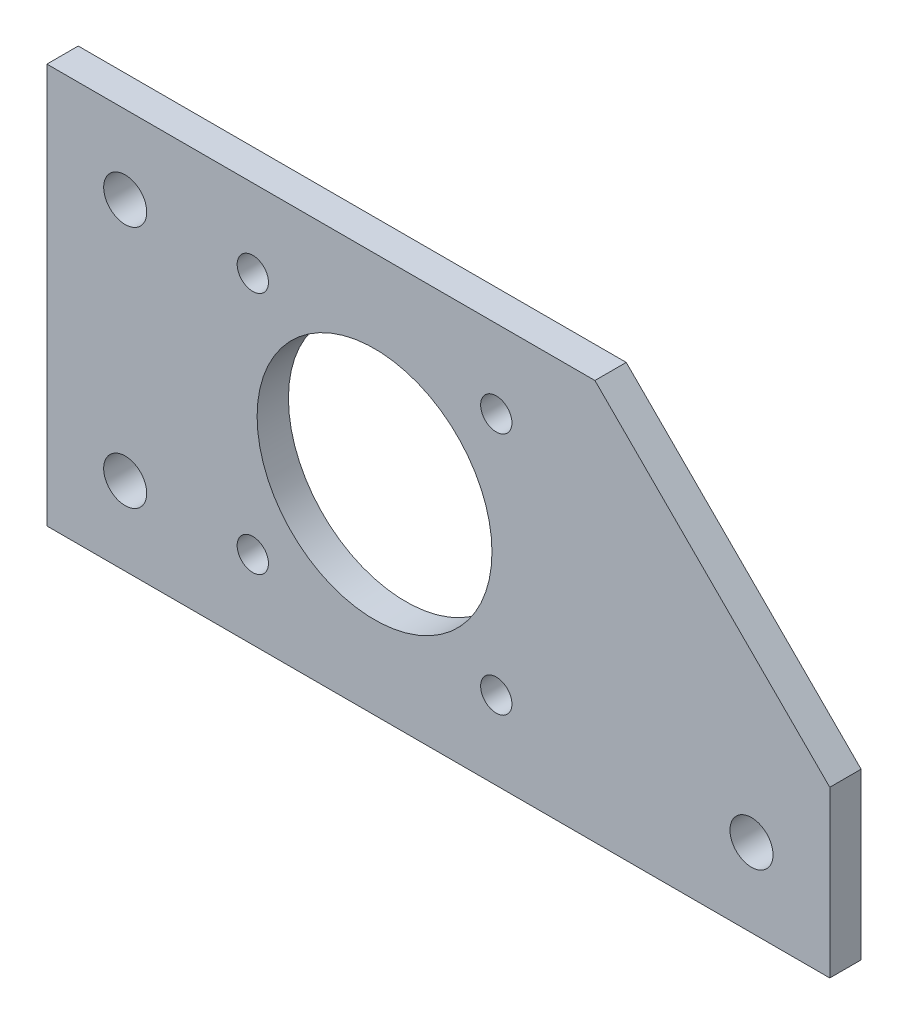
ISO-10303-21;
HEADER;
FILE_DESCRIPTION(('STEP AP214'),'2;1');
FILE_NAME('part.step','',(''),(''),'','','');
FILE_SCHEMA(('AUTOMOTIVE_DESIGN { 1 0 10303 214 1 1 1 1 }'));
ENDSEC;
DATA;
#1=APPLICATION_CONTEXT('core data for automotive mechanical design processes');
#2=APPLICATION_PROTOCOL_DEFINITION('international standard','automotive_design',2000,#1);
#3=PRODUCT_CONTEXT('',#1,'mechanical');
#4=PRODUCT('Part','Part','',(#3));
#5=PRODUCT_RELATED_PRODUCT_CATEGORY('part','',(#4));
#6=PRODUCT_DEFINITION_FORMATION('','',#4);
#7=PRODUCT_DEFINITION_CONTEXT('part definition',#1,'design');
#8=PRODUCT_DEFINITION('design','',#6,#7);
#9=PRODUCT_DEFINITION_SHAPE('','',#8);
#10=(LENGTH_UNIT() NAMED_UNIT(*) SI_UNIT(.MILLI.,.METRE.));
#11=(NAMED_UNIT(*) PLANE_ANGLE_UNIT() SI_UNIT($,.RADIAN.));
#12=(NAMED_UNIT(*) SI_UNIT($,.STERADIAN.) SOLID_ANGLE_UNIT());
#13=UNCERTAINTY_MEASURE_WITH_UNIT(LENGTH_MEASURE(1.E-05),#10,'distance_accuracy_value','');
#14=(GEOMETRIC_REPRESENTATION_CONTEXT(3) GLOBAL_UNCERTAINTY_ASSIGNED_CONTEXT((#13)) GLOBAL_UNIT_ASSIGNED_CONTEXT((#10,
#11,#12)) REPRESENTATION_CONTEXT('',''));
#15=CARTESIAN_POINT('',(0.,0.,0.));
#16=DIRECTION('',(0.,0.,1.));
#17=DIRECTION('',(1.,0.,0.));
#18=AXIS2_PLACEMENT_3D('',#15,#16,#17);
#19=CARTESIAN_POINT('',(-31.5,-21.15,4.));
#20=DIRECTION('',(1.,0.,0.));
#21=DIRECTION('',(0.,0.,-1.));
#22=AXIS2_PLACEMENT_3D('',#19,#20,#21);
#23=PLANE('',#22);
#24=DIRECTION('',(0.,-1.,0.));
#25=VECTOR('',#24,1.);
#26=CARTESIAN_POINT('',(-31.5,-21.15,0.));
#27=LINE('',#26,#25);
#28=CARTESIAN_POINT('',(-31.5,25.55,0.));
#29=VERTEX_POINT('',#28);
#30=CARTESIAN_POINT('',(-31.5,-25.55,0.));
#31=VERTEX_POINT('',#30);
#32=EDGE_CURVE('E96',#29,#31,#27,.T.);
#33=ORIENTED_EDGE('',*,*,#32,.T.);
#34=DIRECTION('',(0.,0.,-1.));
#35=VECTOR('',#34,1.);
#36=CARTESIAN_POINT('',(-31.5,-25.55,4.));
#37=LINE('',#36,#35);
#38=CARTESIAN_POINT('',(-31.5,-25.55,4.));
#39=VERTEX_POINT('',#38);
#40=EDGE_CURVE('E92',#39,#31,#37,.T.);
#41=ORIENTED_EDGE('',*,*,#40,.F.);
#42=DIRECTION('',(0.,-1.,0.));
#43=VECTOR('',#42,1.);
#44=CARTESIAN_POINT('',(-31.5,21.15,4.));
#45=LINE('',#44,#43);
#46=CARTESIAN_POINT('',(-31.5,25.55,4.));
#47=VERTEX_POINT('',#46);
#48=EDGE_CURVE('E159',#47,#39,#45,.T.);
#49=ORIENTED_EDGE('',*,*,#48,.F.);
#50=DIRECTION('',(0.,0.,-1.));
#51=VECTOR('',#50,1.);
#52=CARTESIAN_POINT('',(-31.5,25.55,4.));
#53=LINE('',#52,#51);
#54=EDGE_CURVE('E165',#47,#29,#53,.T.);
#55=ORIENTED_EDGE('',*,*,#54,.T.);
#56=EDGE_LOOP('',(#33,#41,#49,#55));
#57=FACE_BOUND('',#56,.T.);
#58=ADVANCED_FACE('F39',(#57),#23,.F.);
#59=CARTESIAN_POINT('',(-31.5,-25.55,4.));
#60=DIRECTION('',(0.,1.,0.));
#61=DIRECTION('',(0.,0.,1.));
#62=AXIS2_PLACEMENT_3D('',#59,#60,#61);
#63=PLANE('',#62);
#64=DIRECTION('',(1.,0.,0.));
#65=VECTOR('',#64,1.);
#66=CARTESIAN_POINT('',(-31.5,-25.55,0.));
#67=LINE('',#66,#65);
#68=CARTESIAN_POINT('',(68.5,-25.55,0.));
#69=VERTEX_POINT('',#68);
#70=EDGE_CURVE('E85',#31,#69,#67,.T.);
#71=ORIENTED_EDGE('',*,*,#70,.T.);
#72=DIRECTION('',(0.,0.,-1.));
#73=VECTOR('',#72,1.);
#74=CARTESIAN_POINT('',(68.5,-25.55,4.));
#75=LINE('',#74,#73);
#76=CARTESIAN_POINT('',(68.5,-25.55,4.));
#77=VERTEX_POINT('',#76);
#78=EDGE_CURVE('E90',#77,#69,#75,.T.);
#79=ORIENTED_EDGE('',*,*,#78,.F.);
#80=DIRECTION('',(1.,0.,0.));
#81=VECTOR('',#80,1.);
#82=CARTESIAN_POINT('',(-31.5,-25.55,4.));
#83=LINE('',#82,#81);
#84=EDGE_CURVE('E161',#39,#77,#83,.T.);
#85=ORIENTED_EDGE('',*,*,#84,.F.);
#86=ORIENTED_EDGE('',*,*,#40,.T.);
#87=EDGE_LOOP('',(#71,#79,#85,#86));
#88=FACE_BOUND('',#87,.T.);
#89=ADVANCED_FACE('F87',(#88),#63,.F.);
#90=CARTESIAN_POINT('',(-31.5,25.55,4.));
#91=DIRECTION('',(0.,-1.,0.));
#92=DIRECTION('',(0.,0.,-1.));
#93=AXIS2_PLACEMENT_3D('',#90,#91,#92);
#94=PLANE('',#93);
#95=DIRECTION('',(-1.,0.,0.));
#96=VECTOR('',#95,1.);
#97=CARTESIAN_POINT('',(-31.5,25.55,4.));
#98=LINE('',#97,#96);
#99=CARTESIAN_POINT('',(38.4999999999999,25.55,4.));
#100=VERTEX_POINT('',#99);
#101=EDGE_CURVE('E163',#100,#47,#98,.T.);
#102=ORIENTED_EDGE('',*,*,#101,.F.);
#103=DIRECTION('',(0.,0.,-1.));
#104=VECTOR('',#103,1.);
#105=CARTESIAN_POINT('',(38.4999999999999,25.55,0.));
#106=LINE('',#105,#104);
#107=CARTESIAN_POINT('',(38.4999999999999,25.55,0.));
#108=VERTEX_POINT('',#107);
#109=EDGE_CURVE('E47',#100,#108,#106,.T.);
#110=ORIENTED_EDGE('',*,*,#109,.T.);
#111=DIRECTION('',(-1.,0.,0.));
#112=VECTOR('',#111,1.);
#113=CARTESIAN_POINT('',(-31.5,25.55,0.));
#114=LINE('',#113,#112);
#115=EDGE_CURVE('E95',#108,#29,#114,.T.);
#116=ORIENTED_EDGE('',*,*,#115,.T.);
#117=ORIENTED_EDGE('',*,*,#54,.F.);
#118=EDGE_LOOP('',(#102,#110,#116,#117));
#119=FACE_BOUND('',#118,.T.);
#120=ADVANCED_FACE('F189',(#119),#94,.F.);
#121=CARTESIAN_POINT('',(0.,0.,4.));
#122=DIRECTION('',(0.,0.,-1.));
#123=DIRECTION('',(-1.,0.,0.));
#124=AXIS2_PLACEMENT_3D('',#121,#122,#123);
#125=PLANE('',#124);
#126=CARTESIAN_POINT('',(58.5,-15.55,4.));
#127=DIRECTION('',(0.,0.,1.));
#128=DIRECTION('',(1.,0.,0.));
#129=AXIS2_PLACEMENT_3D('',#126,#127,#128);
#130=CIRCLE('',#129,2.75000000000001);
#131=CARTESIAN_POINT('',(61.25,-15.55,4.));
#132=VERTEX_POINT('',#131);
#133=EDGE_CURVE('E109',#132,#132,#130,.T.);
#134=ORIENTED_EDGE('',*,*,#133,.F.);
#135=EDGE_LOOP('',(#134));
#136=FACE_BOUND('',#135,.T.);
#137=CARTESIAN_POINT('',(-21.5,15.55,4.));
#138=DIRECTION('',(0.,0.,1.));
#139=DIRECTION('',(1.,0.,0.));
#140=AXIS2_PLACEMENT_3D('',#137,#138,#139);
#141=CIRCLE('',#140,2.75);
#142=CARTESIAN_POINT('',(-18.75,15.55,4.));
#143=VERTEX_POINT('',#142);
#144=EDGE_CURVE('E130',#143,#143,#141,.T.);
#145=ORIENTED_EDGE('',*,*,#144,.F.);
#146=EDGE_LOOP('',(#145));
#147=FACE_BOUND('',#146,.T.);
#148=CARTESIAN_POINT('',(-21.5,-15.55,4.));
#149=DIRECTION('',(0.,0.,1.));
#150=DIRECTION('',(1.,0.,0.));
#151=AXIS2_PLACEMENT_3D('',#148,#149,#150);
#152=CIRCLE('',#151,2.75);
#153=CARTESIAN_POINT('',(-18.75,-15.55,4.));
#154=VERTEX_POINT('',#153);
#155=EDGE_CURVE('E118',#154,#154,#152,.T.);
#156=ORIENTED_EDGE('',*,*,#155,.F.);
#157=EDGE_LOOP('',(#156));
#158=FACE_BOUND('',#157,.T.);
#159=CARTESIAN_POINT('',(10.35,0.,4.));
#160=DIRECTION('',(0.,0.,1.));
#161=DIRECTION('',(1.,0.,0.));
#162=AXIS2_PLACEMENT_3D('',#159,#160,#161);
#163=CIRCLE('',#162,15.);
#164=CARTESIAN_POINT('',(25.35,0.,4.));
#165=VERTEX_POINT('',#164);
#166=EDGE_CURVE('E125',#165,#165,#163,.T.);
#167=ORIENTED_EDGE('',*,*,#166,.F.);
#168=EDGE_LOOP('',(#167));
#169=FACE_BOUND('',#168,.T.);
#170=CARTESIAN_POINT('',(-5.2,-15.55,4.));
#171=DIRECTION('',(0.,0.,1.));
#172=DIRECTION('',(1.,0.,0.));
#173=AXIS2_PLACEMENT_3D('',#170,#171,#172);
#174=CIRCLE('',#173,2.);
#175=CARTESIAN_POINT('',(-3.2,-15.55,4.));
#176=VERTEX_POINT('',#175);
#177=EDGE_CURVE('E149',#176,#176,#174,.T.);
#178=ORIENTED_EDGE('',*,*,#177,.F.);
#179=EDGE_LOOP('',(#178));
#180=FACE_BOUND('',#179,.T.);
#181=CARTESIAN_POINT('',(25.9,-15.55,4.));
#182=DIRECTION('',(0.,0.,1.));
#183=DIRECTION('',(1.,0.,0.));
#184=AXIS2_PLACEMENT_3D('',#181,#182,#183);
#185=CIRCLE('',#184,2.);
#186=CARTESIAN_POINT('',(27.9,-15.55,4.));
#187=VERTEX_POINT('',#186);
#188=EDGE_CURVE('E143',#187,#187,#185,.T.);
#189=ORIENTED_EDGE('',*,*,#188,.F.);
#190=EDGE_LOOP('',(#189));
#191=FACE_BOUND('',#190,.T.);
#192=CARTESIAN_POINT('',(25.9,15.55,4.));
#193=DIRECTION('',(0.,0.,1.));
#194=DIRECTION('',(1.,0.,0.));
#195=AXIS2_PLACEMENT_3D('',#192,#193,#194);
#196=CIRCLE('',#195,2.00000000000001);
#197=CARTESIAN_POINT('',(27.9,15.55,4.));
#198=VERTEX_POINT('',#197);
#199=EDGE_CURVE('E136',#198,#198,#196,.T.);
#200=ORIENTED_EDGE('',*,*,#199,.F.);
#201=EDGE_LOOP('',(#200));
#202=FACE_BOUND('',#201,.T.);
#203=CARTESIAN_POINT('',(-5.2,15.55,4.));
#204=DIRECTION('',(0.,0.,1.));
#205=DIRECTION('',(1.,0.,0.));
#206=AXIS2_PLACEMENT_3D('',#203,#204,#205);
#207=CIRCLE('',#206,2.);
#208=CARTESIAN_POINT('',(-3.2,15.55,4.));
#209=VERTEX_POINT('',#208);
#210=EDGE_CURVE('E154',#209,#209,#207,.T.);
#211=ORIENTED_EDGE('',*,*,#210,.F.);
#212=EDGE_LOOP('',(#211));
#213=FACE_BOUND('',#212,.T.);
#214=DIRECTION('',(0.,-1.,0.));
#215=VECTOR('',#214,1.);
#216=CARTESIAN_POINT('',(68.5,-25.55,4.));
#217=LINE('',#216,#215);
#218=CARTESIAN_POINT('',(68.5,-4.45000000000001,4.));
#219=VERTEX_POINT('',#218);
#220=EDGE_CURVE('E105',#219,#77,#217,.T.);
#221=ORIENTED_EDGE('',*,*,#220,.F.);
#222=DIRECTION('',(-0.707106781186549,0.707106781186546,0.));
#223=VECTOR('',#222,1.);
#224=CARTESIAN_POINT('',(68.5,-4.45000000000001,4.));
#225=LINE('',#224,#223);
#226=EDGE_CURVE('E61',#219,#100,#225,.T.);
#227=ORIENTED_EDGE('',*,*,#226,.T.);
#228=ORIENTED_EDGE('',*,*,#101,.T.);
#229=ORIENTED_EDGE('',*,*,#48,.T.);
#230=ORIENTED_EDGE('',*,*,#84,.T.);
#231=EDGE_LOOP('',(#221,#227,#228,#229,#230));
#232=FACE_BOUND('',#231,.T.);
#233=ADVANCED_FACE('F174',(#136,#147,#158,#169,#180,#191,#202,#213,#232),#125,.F.);
#234=CARTESIAN_POINT('',(0.,0.,0.));
#235=DIRECTION('',(0.,0.,-1.));
#236=DIRECTION('',(-1.,0.,0.));
#237=AXIS2_PLACEMENT_3D('',#234,#235,#236);
#238=PLANE('',#237);
#239=CARTESIAN_POINT('',(58.5,-15.55,0.));
#240=DIRECTION('',(0.,0.,-1.));
#241=DIRECTION('',(-1.,0.,0.));
#242=AXIS2_PLACEMENT_3D('',#239,#240,#241);
#243=CIRCLE('',#242,2.75000000000001);
#244=CARTESIAN_POINT('',(55.75,-15.55,0.));
#245=VERTEX_POINT('',#244);
#246=EDGE_CURVE('E112',#245,#245,#243,.F.);
#247=ORIENTED_EDGE('',*,*,#246,.T.);
#248=EDGE_LOOP('',(#247));
#249=FACE_BOUND('',#248,.T.);
#250=CARTESIAN_POINT('',(-21.5,15.55,0.));
#251=DIRECTION('',(0.,0.,-1.));
#252=DIRECTION('',(-1.,0.,0.));
#253=AXIS2_PLACEMENT_3D('',#250,#251,#252);
#254=CIRCLE('',#253,2.75);
#255=CARTESIAN_POINT('',(-24.25,15.55,0.));
#256=VERTEX_POINT('',#255);
#257=EDGE_CURVE('E121',#256,#256,#254,.F.);
#258=ORIENTED_EDGE('',*,*,#257,.T.);
#259=EDGE_LOOP('',(#258));
#260=FACE_BOUND('',#259,.T.);
#261=CARTESIAN_POINT('',(-21.5,-15.55,0.));
#262=DIRECTION('',(0.,0.,-1.));
#263=DIRECTION('',(-1.,0.,0.));
#264=AXIS2_PLACEMENT_3D('',#261,#262,#263);
#265=CIRCLE('',#264,2.75);
#266=CARTESIAN_POINT('',(-24.25,-15.55,0.));
#267=VERTEX_POINT('',#266);
#268=EDGE_CURVE('E122',#267,#267,#265,.F.);
#269=ORIENTED_EDGE('',*,*,#268,.T.);
#270=EDGE_LOOP('',(#269));
#271=FACE_BOUND('',#270,.T.);
#272=CARTESIAN_POINT('',(10.35,0.,0.));
#273=DIRECTION('',(0.,0.,-1.));
#274=DIRECTION('',(-1.,0.,0.));
#275=AXIS2_PLACEMENT_3D('',#272,#273,#274);
#276=CIRCLE('',#275,15.);
#277=CARTESIAN_POINT('',(-4.65,0.,0.));
#278=VERTEX_POINT('',#277);
#279=EDGE_CURVE('E117',#278,#278,#276,.F.);
#280=ORIENTED_EDGE('',*,*,#279,.T.);
#281=EDGE_LOOP('',(#280));
#282=FACE_BOUND('',#281,.T.);
#283=CARTESIAN_POINT('',(-5.2,-15.55,0.));
#284=DIRECTION('',(0.,0.,-1.));
#285=DIRECTION('',(-1.,0.,0.));
#286=AXIS2_PLACEMENT_3D('',#283,#284,#285);
#287=CIRCLE('',#286,2.);
#288=CARTESIAN_POINT('',(-7.2,-15.55,0.));
#289=VERTEX_POINT('',#288);
#290=EDGE_CURVE('E133',#289,#289,#287,.F.);
#291=ORIENTED_EDGE('',*,*,#290,.T.);
#292=EDGE_LOOP('',(#291));
#293=FACE_BOUND('',#292,.T.);
#294=CARTESIAN_POINT('',(25.9,-15.55,0.));
#295=DIRECTION('',(0.,0.,-1.));
#296=DIRECTION('',(-1.,0.,0.));
#297=AXIS2_PLACEMENT_3D('',#294,#295,#296);
#298=CIRCLE('',#297,2.);
#299=CARTESIAN_POINT('',(23.9,-15.55,0.));
#300=VERTEX_POINT('',#299);
#301=EDGE_CURVE('E146',#300,#300,#298,.F.);
#302=ORIENTED_EDGE('',*,*,#301,.T.);
#303=EDGE_LOOP('',(#302));
#304=FACE_BOUND('',#303,.T.);
#305=CARTESIAN_POINT('',(25.9,15.55,0.));
#306=DIRECTION('',(0.,0.,-1.));
#307=DIRECTION('',(-1.,0.,0.));
#308=AXIS2_PLACEMENT_3D('',#305,#306,#307);
#309=CIRCLE('',#308,2.00000000000001);
#310=CARTESIAN_POINT('',(23.9,15.55,0.));
#311=VERTEX_POINT('',#310);
#312=EDGE_CURVE('E140',#311,#311,#309,.F.);
#313=ORIENTED_EDGE('',*,*,#312,.T.);
#314=EDGE_LOOP('',(#313));
#315=FACE_BOUND('',#314,.T.);
#316=CARTESIAN_POINT('',(-5.2,15.55,0.));
#317=DIRECTION('',(0.,0.,-1.));
#318=DIRECTION('',(-1.,0.,0.));
#319=AXIS2_PLACEMENT_3D('',#316,#317,#318);
#320=CIRCLE('',#319,2.);
#321=CARTESIAN_POINT('',(-7.2,15.55,0.));
#322=VERTEX_POINT('',#321);
#323=EDGE_CURVE('E139',#322,#322,#320,.F.);
#324=ORIENTED_EDGE('',*,*,#323,.T.);
#325=EDGE_LOOP('',(#324));
#326=FACE_BOUND('',#325,.T.);
#327=ORIENTED_EDGE('',*,*,#115,.F.);
#328=DIRECTION('',(0.707106781186549,-0.707106781186546,0.));
#329=VECTOR('',#328,1.);
#330=CARTESIAN_POINT('',(32.0249999999999,32.025,0.));
#331=LINE('',#330,#329);
#332=CARTESIAN_POINT('',(68.5,-4.45000000000001,0.));
#333=VERTEX_POINT('',#332);
#334=EDGE_CURVE('E11',#108,#333,#331,.T.);
#335=ORIENTED_EDGE('',*,*,#334,.T.);
#336=DIRECTION('',(0.,1.,0.));
#337=VECTOR('',#336,1.);
#338=CARTESIAN_POINT('',(68.5,-25.55,0.));
#339=LINE('',#338,#337);
#340=EDGE_CURVE('E99',#69,#333,#339,.T.);
#341=ORIENTED_EDGE('',*,*,#340,.F.);
#342=ORIENTED_EDGE('',*,*,#70,.F.);
#343=ORIENTED_EDGE('',*,*,#32,.F.);
#344=EDGE_LOOP('',(#327,#335,#341,#342,#343));
#345=FACE_BOUND('',#344,.T.);
#346=ADVANCED_FACE('F100',(#249,#260,#271,#282,#293,#304,#315,#326,#345),#238,.T.);
#347=CARTESIAN_POINT('',(-5.2,15.55,-0.00100000000000013));
#348=DIRECTION('',(0.,0.,1.));
#349=DIRECTION('',(1.,0.,0.));
#350=AXIS2_PLACEMENT_3D('',#347,#348,#349);
#351=CYLINDRICAL_SURFACE('',#350,2.);
#352=ORIENTED_EDGE('',*,*,#323,.F.);
#353=EDGE_LOOP('',(#352));
#354=FACE_BOUND('',#353,.T.);
#355=ORIENTED_EDGE('',*,*,#210,.T.);
#356=EDGE_LOOP('',(#355));
#357=FACE_BOUND('',#356,.T.);
#358=ADVANCED_FACE('F196',(#354,#357),#351,.F.);
#359=CARTESIAN_POINT('',(25.9,15.55,-0.00100000000000013));
#360=DIRECTION('',(0.,0.,1.));
#361=DIRECTION('',(1.,0.,0.));
#362=AXIS2_PLACEMENT_3D('',#359,#360,#361);
#363=CYLINDRICAL_SURFACE('',#362,2.00000000000001);
#364=ORIENTED_EDGE('',*,*,#312,.F.);
#365=EDGE_LOOP('',(#364));
#366=FACE_BOUND('',#365,.T.);
#367=ORIENTED_EDGE('',*,*,#199,.T.);
#368=EDGE_LOOP('',(#367));
#369=FACE_BOUND('',#368,.T.);
#370=ADVANCED_FACE('F203',(#366,#369),#363,.F.);
#371=CARTESIAN_POINT('',(25.9,-15.55,-0.00100000000000013));
#372=DIRECTION('',(0.,0.,1.));
#373=DIRECTION('',(1.,0.,0.));
#374=AXIS2_PLACEMENT_3D('',#371,#372,#373);
#375=CYLINDRICAL_SURFACE('',#374,2.);
#376=ORIENTED_EDGE('',*,*,#301,.F.);
#377=EDGE_LOOP('',(#376));
#378=FACE_BOUND('',#377,.T.);
#379=ORIENTED_EDGE('',*,*,#188,.T.);
#380=EDGE_LOOP('',(#379));
#381=FACE_BOUND('',#380,.T.);
#382=ADVANCED_FACE('F209',(#378,#381),#375,.F.);
#383=CARTESIAN_POINT('',(-5.2,-15.55,-0.00100000000000013));
#384=DIRECTION('',(0.,0.,1.));
#385=DIRECTION('',(1.,0.,0.));
#386=AXIS2_PLACEMENT_3D('',#383,#384,#385);
#387=CYLINDRICAL_SURFACE('',#386,2.);
#388=ORIENTED_EDGE('',*,*,#290,.F.);
#389=EDGE_LOOP('',(#388));
#390=FACE_BOUND('',#389,.T.);
#391=ORIENTED_EDGE('',*,*,#177,.T.);
#392=EDGE_LOOP('',(#391));
#393=FACE_BOUND('',#392,.T.);
#394=ADVANCED_FACE('F205',(#390,#393),#387,.F.);
#395=CARTESIAN_POINT('',(10.35,0.,-0.00100000000000013));
#396=DIRECTION('',(0.,0.,1.));
#397=DIRECTION('',(1.,0.,0.));
#398=AXIS2_PLACEMENT_3D('',#395,#396,#397);
#399=CYLINDRICAL_SURFACE('',#398,15.);
#400=ORIENTED_EDGE('',*,*,#279,.F.);
#401=EDGE_LOOP('',(#400));
#402=FACE_BOUND('',#401,.T.);
#403=ORIENTED_EDGE('',*,*,#166,.T.);
#404=EDGE_LOOP('',(#403));
#405=FACE_BOUND('',#404,.T.);
#406=ADVANCED_FACE('F208',(#402,#405),#399,.F.);
#407=CARTESIAN_POINT('',(-21.5,-15.55,-0.00100000000000013));
#408=DIRECTION('',(0.,0.,1.));
#409=DIRECTION('',(1.,0.,0.));
#410=AXIS2_PLACEMENT_3D('',#407,#408,#409);
#411=CYLINDRICAL_SURFACE('',#410,2.75);
#412=ORIENTED_EDGE('',*,*,#268,.F.);
#413=EDGE_LOOP('',(#412));
#414=FACE_BOUND('',#413,.T.);
#415=ORIENTED_EDGE('',*,*,#155,.T.);
#416=EDGE_LOOP('',(#415));
#417=FACE_BOUND('',#416,.T.);
#418=ADVANCED_FACE('F220',(#414,#417),#411,.F.);
#419=CARTESIAN_POINT('',(-21.5,15.55,-0.00100000000000013));
#420=DIRECTION('',(0.,0.,1.));
#421=DIRECTION('',(1.,0.,0.));
#422=AXIS2_PLACEMENT_3D('',#419,#420,#421);
#423=CYLINDRICAL_SURFACE('',#422,2.75);
#424=ORIENTED_EDGE('',*,*,#257,.F.);
#425=EDGE_LOOP('',(#424));
#426=FACE_BOUND('',#425,.T.);
#427=ORIENTED_EDGE('',*,*,#144,.T.);
#428=EDGE_LOOP('',(#427));
#429=FACE_BOUND('',#428,.T.);
#430=ADVANCED_FACE('F217',(#426,#429),#423,.F.);
#431=CARTESIAN_POINT('',(68.5,0.,0.));
#432=DIRECTION('',(1.,0.,0.));
#433=DIRECTION('',(0.,0.,-1.));
#434=AXIS2_PLACEMENT_3D('',#431,#432,#433);
#435=PLANE('',#434);
#436=ORIENTED_EDGE('',*,*,#340,.T.);
#437=DIRECTION('',(0.,0.,1.));
#438=VECTOR('',#437,1.);
#439=CARTESIAN_POINT('',(68.5,-4.45000000000001,4.));
#440=LINE('',#439,#438);
#441=EDGE_CURVE('E171',#333,#219,#440,.T.);
#442=ORIENTED_EDGE('',*,*,#441,.T.);
#443=ORIENTED_EDGE('',*,*,#220,.T.);
#444=ORIENTED_EDGE('',*,*,#78,.T.);
#445=EDGE_LOOP('',(#436,#442,#443,#444));
#446=FACE_BOUND('',#445,.T.);
#447=ADVANCED_FACE('F107',(#446),#435,.T.);
#448=CARTESIAN_POINT('',(58.5,-15.55,-0.00100000000000013));
#449=DIRECTION('',(0.,0.,1.));
#450=DIRECTION('',(1.,0.,0.));
#451=AXIS2_PLACEMENT_3D('',#448,#449,#450);
#452=CYLINDRICAL_SURFACE('',#451,2.75000000000001);
#453=ORIENTED_EDGE('',*,*,#246,.F.);
#454=EDGE_LOOP('',(#453));
#455=FACE_BOUND('',#454,.T.);
#456=ORIENTED_EDGE('',*,*,#133,.T.);
#457=EDGE_LOOP('',(#456));
#458=FACE_BOUND('',#457,.T.);
#459=ADVANCED_FACE('F179',(#455,#458),#452,.F.);
#460=CARTESIAN_POINT('',(68.5,-4.45000000000001,0.));
#461=DIRECTION('',(0.707106781186546,0.707106781186549,0.));
#462=DIRECTION('',(0.,0.,-1.));
#463=AXIS2_PLACEMENT_3D('',#460,#461,#462);
#464=PLANE('',#463);
#465=ORIENTED_EDGE('',*,*,#334,.F.);
#466=ORIENTED_EDGE('',*,*,#109,.F.);
#467=ORIENTED_EDGE('',*,*,#226,.F.);
#468=ORIENTED_EDGE('',*,*,#441,.F.);
#469=EDGE_LOOP('',(#465,#466,#467,#468));
#470=FACE_BOUND('',#469,.T.);
#471=ADVANCED_FACE('F41',(#470),#464,.T.);
#472=CLOSED_SHELL('',(#58,#89,#120,#233,#346,#358,#370,#382,#394,#406,#418,#430,#447,#459,#471));
#473=MANIFOLD_SOLID_BREP('B2',#472);
#474=ADVANCED_BREP_SHAPE_REPRESENTATION('',(#18,#473),#14);
#475=SHAPE_DEFINITION_REPRESENTATION(#9,#474);
ENDSEC;
END-ISO-10303-21;
